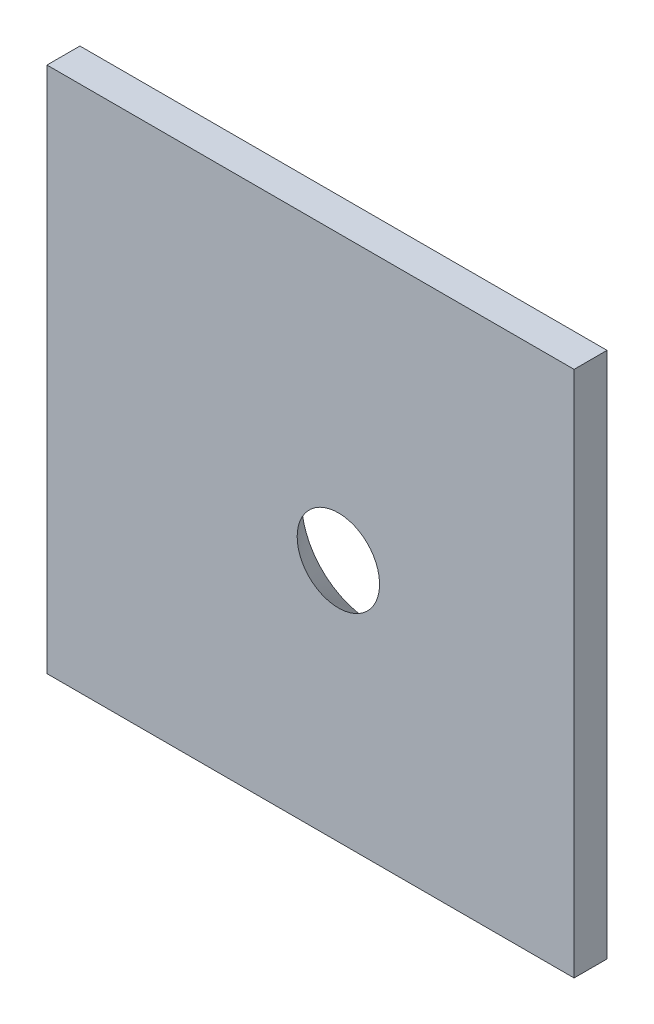
ISO-10303-21;
HEADER;
FILE_DESCRIPTION(('STEP AP214'),'2;1');
FILE_NAME('part.step','',(''),(''),'','','');
FILE_SCHEMA(('AUTOMOTIVE_DESIGN { 1 0 10303 214 1 1 1 1 }'));
ENDSEC;
DATA;
#1=APPLICATION_CONTEXT('core data for automotive mechanical design processes');
#2=APPLICATION_PROTOCOL_DEFINITION('international standard','automotive_design',2000,#1);
#3=PRODUCT_CONTEXT('',#1,'mechanical');
#4=PRODUCT('Part','Part','',(#3));
#5=PRODUCT_RELATED_PRODUCT_CATEGORY('part','',(#4));
#6=PRODUCT_DEFINITION_FORMATION('','',#4);
#7=PRODUCT_DEFINITION_CONTEXT('part definition',#1,'design');
#8=PRODUCT_DEFINITION('design','',#6,#7);
#9=PRODUCT_DEFINITION_SHAPE('','',#8);
#10=(LENGTH_UNIT() NAMED_UNIT(*) SI_UNIT(.MILLI.,.METRE.));
#11=(NAMED_UNIT(*) PLANE_ANGLE_UNIT() SI_UNIT($,.RADIAN.));
#12=(NAMED_UNIT(*) SI_UNIT($,.STERADIAN.) SOLID_ANGLE_UNIT());
#13=UNCERTAINTY_MEASURE_WITH_UNIT(LENGTH_MEASURE(1.E-05),#10,'distance_accuracy_value','');
#14=(GEOMETRIC_REPRESENTATION_CONTEXT(3) GLOBAL_UNCERTAINTY_ASSIGNED_CONTEXT((#13)) GLOBAL_UNIT_ASSIGNED_CONTEXT((#10,
#11,#12)) REPRESENTATION_CONTEXT('',''));
#15=CARTESIAN_POINT('',(0.,0.,0.));
#16=DIRECTION('',(0.,0.,1.));
#17=DIRECTION('',(1.,0.,0.));
#18=AXIS2_PLACEMENT_3D('',#15,#16,#17);
#19=CARTESIAN_POINT('',(0.,0.,3.175));
#20=DIRECTION('',(0.,0.,-1.));
#21=DIRECTION('',(-1.,0.,0.));
#22=AXIS2_PLACEMENT_3D('',#19,#20,#21);
#23=PLANE('',#22);
#24=CARTESIAN_POINT('',(28.0836313430086,-27.305207034928,3.175));
#25=DIRECTION('',(0.,0.,-1.));
#26=DIRECTION('',(-1.,0.,0.));
#27=AXIS2_PLACEMENT_3D('',#24,#25,#26);
#28=CIRCLE('',#27,3.97101460743348);
#29=CARTESIAN_POINT('',(24.1126167355751,-27.305207034928,3.175));
#30=VERTEX_POINT('',#29);
#31=EDGE_CURVE('E120',#30,#30,#28,.T.);
#32=ORIENTED_EDGE('',*,*,#31,.T.);
#33=EDGE_LOOP('',(#32));
#34=FACE_BOUND('',#33,.T.);
#35=DIRECTION('',(1.,0.,0.));
#36=VECTOR('',#35,1.);
#37=CARTESIAN_POINT('',(0.,0.,3.175));
#38=LINE('',#37,#36);
#39=CARTESIAN_POINT('',(0.,0.,3.175));
#40=VERTEX_POINT('',#39);
#41=CARTESIAN_POINT('',(50.8,0.,3.175));
#42=VERTEX_POINT('',#41);
#43=EDGE_CURVE('E107',#40,#42,#38,.T.);
#44=ORIENTED_EDGE('',*,*,#43,.F.);
#45=DIRECTION('',(0.,-1.,0.));
#46=VECTOR('',#45,1.);
#47=CARTESIAN_POINT('',(0.,0.,3.175));
#48=LINE('',#47,#46);
#49=CARTESIAN_POINT('',(0.,-50.8,3.175));
#50=VERTEX_POINT('',#49);
#51=EDGE_CURVE('E94',#40,#50,#48,.T.);
#52=ORIENTED_EDGE('',*,*,#51,.T.);
#53=DIRECTION('',(1.,0.,0.));
#54=VECTOR('',#53,1.);
#55=CARTESIAN_POINT('',(0.,-50.8,3.175));
#56=LINE('',#55,#54);
#57=CARTESIAN_POINT('',(50.8,-50.8,3.175));
#58=VERTEX_POINT('',#57);
#59=EDGE_CURVE('E90',#50,#58,#56,.T.);
#60=ORIENTED_EDGE('',*,*,#59,.T.);
#61=DIRECTION('',(0.,-1.,0.));
#62=VECTOR('',#61,1.);
#63=CARTESIAN_POINT('',(50.8,0.,3.175));
#64=LINE('',#63,#62);
#65=EDGE_CURVE('E93',#42,#58,#64,.T.);
#66=ORIENTED_EDGE('',*,*,#65,.F.);
#67=EDGE_LOOP('',(#44,#52,#60,#66));
#68=FACE_BOUND('',#67,.T.);
#69=ADVANCED_FACE('F43',(#34,#68),#23,.F.);
#70=CARTESIAN_POINT('',(0.,0.,3.175));
#71=DIRECTION('',(0.,1.,0.));
#72=DIRECTION('',(0.,0.,1.));
#73=AXIS2_PLACEMENT_3D('',#70,#71,#72);
#74=PLANE('',#73);
#75=DIRECTION('',(1.,0.,0.));
#76=VECTOR('',#75,1.);
#77=CARTESIAN_POINT('',(0.,0.,0.));
#78=LINE('',#77,#76);
#79=CARTESIAN_POINT('',(0.,0.,0.));
#80=VERTEX_POINT('',#79);
#81=CARTESIAN_POINT('',(50.8,0.,0.));
#82=VERTEX_POINT('',#81);
#83=EDGE_CURVE('E115',#80,#82,#78,.T.);
#84=ORIENTED_EDGE('',*,*,#83,.F.);
#85=DIRECTION('',(0.,0.,-1.));
#86=VECTOR('',#85,1.);
#87=CARTESIAN_POINT('',(0.,0.,3.175));
#88=LINE('',#87,#86);
#89=EDGE_CURVE('E11',#40,#80,#88,.T.);
#90=ORIENTED_EDGE('',*,*,#89,.F.);
#91=ORIENTED_EDGE('',*,*,#43,.T.);
#92=DIRECTION('',(0.,0.,-1.));
#93=VECTOR('',#92,1.);
#94=CARTESIAN_POINT('',(50.8,0.,3.175));
#95=LINE('',#94,#93);
#96=EDGE_CURVE('E47',#42,#82,#95,.T.);
#97=ORIENTED_EDGE('',*,*,#96,.T.);
#98=EDGE_LOOP('',(#84,#90,#91,#97));
#99=FACE_BOUND('',#98,.T.);
#100=ADVANCED_FACE('F45',(#99),#74,.T.);
#101=CARTESIAN_POINT('',(0.,0.,3.175));
#102=DIRECTION('',(1.,0.,0.));
#103=DIRECTION('',(0.,1.,0.));
#104=AXIS2_PLACEMENT_3D('',#101,#102,#103);
#105=PLANE('',#104);
#106=DIRECTION('',(0.,-1.,0.));
#107=VECTOR('',#106,1.);
#108=CARTESIAN_POINT('',(0.,0.,0.));
#109=LINE('',#108,#107);
#110=CARTESIAN_POINT('',(0.,-50.8,0.));
#111=VERTEX_POINT('',#110);
#112=EDGE_CURVE('E78',#80,#111,#109,.T.);
#113=ORIENTED_EDGE('',*,*,#112,.T.);
#114=DIRECTION('',(0.,0.,-1.));
#115=VECTOR('',#114,1.);
#116=CARTESIAN_POINT('',(0.,-50.8,3.175));
#117=LINE('',#116,#115);
#118=EDGE_CURVE('E54',#50,#111,#117,.T.);
#119=ORIENTED_EDGE('',*,*,#118,.F.);
#120=ORIENTED_EDGE('',*,*,#51,.F.);
#121=ORIENTED_EDGE('',*,*,#89,.T.);
#122=EDGE_LOOP('',(#113,#119,#120,#121));
#123=FACE_BOUND('',#122,.T.);
#124=ADVANCED_FACE('F132',(#123),#105,.F.);
#125=CARTESIAN_POINT('',(0.,-50.8,3.175));
#126=DIRECTION('',(0.,1.,0.));
#127=DIRECTION('',(0.,0.,1.));
#128=AXIS2_PLACEMENT_3D('',#125,#126,#127);
#129=PLANE('',#128);
#130=DIRECTION('',(1.,0.,0.));
#131=VECTOR('',#130,1.);
#132=CARTESIAN_POINT('',(0.,-50.8,0.));
#133=LINE('',#132,#131);
#134=CARTESIAN_POINT('',(50.8,-50.8,0.));
#135=VERTEX_POINT('',#134);
#136=EDGE_CURVE('E102',#111,#135,#133,.T.);
#137=ORIENTED_EDGE('',*,*,#136,.T.);
#138=DIRECTION('',(0.,0.,-1.));
#139=VECTOR('',#138,1.);
#140=CARTESIAN_POINT('',(50.8,-50.8,3.175));
#141=LINE('',#140,#139);
#142=EDGE_CURVE('E99',#58,#135,#141,.T.);
#143=ORIENTED_EDGE('',*,*,#142,.F.);
#144=ORIENTED_EDGE('',*,*,#59,.F.);
#145=ORIENTED_EDGE('',*,*,#118,.T.);
#146=EDGE_LOOP('',(#137,#143,#144,#145));
#147=FACE_BOUND('',#146,.T.);
#148=ADVANCED_FACE('F100',(#147),#129,.F.);
#149=CARTESIAN_POINT('',(50.8,0.,3.175));
#150=DIRECTION('',(1.,0.,0.));
#151=DIRECTION('',(0.,1.,0.));
#152=AXIS2_PLACEMENT_3D('',#149,#150,#151);
#153=PLANE('',#152);
#154=DIRECTION('',(0.,-1.,0.));
#155=VECTOR('',#154,1.);
#156=CARTESIAN_POINT('',(50.8,0.,0.));
#157=LINE('',#156,#155);
#158=EDGE_CURVE('E119',#82,#135,#157,.T.);
#159=ORIENTED_EDGE('',*,*,#158,.F.);
#160=ORIENTED_EDGE('',*,*,#96,.F.);
#161=ORIENTED_EDGE('',*,*,#65,.T.);
#162=ORIENTED_EDGE('',*,*,#142,.T.);
#163=EDGE_LOOP('',(#159,#160,#161,#162));
#164=FACE_BOUND('',#163,.T.);
#165=ADVANCED_FACE('F105',(#164),#153,.T.);
#166=CARTESIAN_POINT('',(0.,0.,0.));
#167=DIRECTION('',(0.,0.,-1.));
#168=DIRECTION('',(-1.,0.,0.));
#169=AXIS2_PLACEMENT_3D('',#166,#167,#168);
#170=PLANE('',#169);
#171=CARTESIAN_POINT('',(28.0836313430086,-27.305207034928,0.));
#172=DIRECTION('',(0.,0.,-1.));
#173=DIRECTION('',(-1.,0.,0.));
#174=AXIS2_PLACEMENT_3D('',#171,#172,#173);
#175=CIRCLE('',#174,6.731);
#176=CARTESIAN_POINT('',(21.3526313430086,-27.305207034928,0.));
#177=VERTEX_POINT('',#176);
#178=EDGE_CURVE('E208',#177,#177,#175,.T.);
#179=ORIENTED_EDGE('',*,*,#178,.F.);
#180=EDGE_LOOP('',(#179));
#181=FACE_BOUND('',#180,.T.);
#182=ORIENTED_EDGE('',*,*,#83,.T.);
#183=ORIENTED_EDGE('',*,*,#158,.T.);
#184=ORIENTED_EDGE('',*,*,#136,.F.);
#185=ORIENTED_EDGE('',*,*,#112,.F.);
#186=EDGE_LOOP('',(#182,#183,#184,#185));
#187=FACE_BOUND('',#186,.T.);
#188=ADVANCED_FACE('F129',(#181,#187),#170,.T.);
#189=CARTESIAN_POINT('',(28.0836313430086,-27.305207034928,0.));
#190=DIRECTION('',(0.,0.,-1.));
#191=DIRECTION('',(-1.,0.,0.));
#192=AXIS2_PLACEMENT_3D('',#189,#190,#191);
#193=CONICAL_SURFACE('',#192,6.731,0.715584993317675);
#194=ORIENTED_EDGE('',*,*,#178,.T.);
#195=EDGE_LOOP('',(#194));
#196=FACE_BOUND('',#195,.T.);
#197=ORIENTED_EDGE('',*,*,#31,.F.);
#198=EDGE_LOOP('',(#197));
#199=FACE_BOUND('',#198,.T.);
#200=ADVANCED_FACE('F145',(#196,#199),#193,.F.);
#201=CLOSED_SHELL('',(#69,#100,#124,#148,#165,#188,#200));
#202=MANIFOLD_SOLID_BREP('B2',#201);
#203=ADVANCED_BREP_SHAPE_REPRESENTATION('',(#18,#202),#14);
#204=SHAPE_DEFINITION_REPRESENTATION(#9,#203);
ENDSEC;
END-ISO-10303-21;
